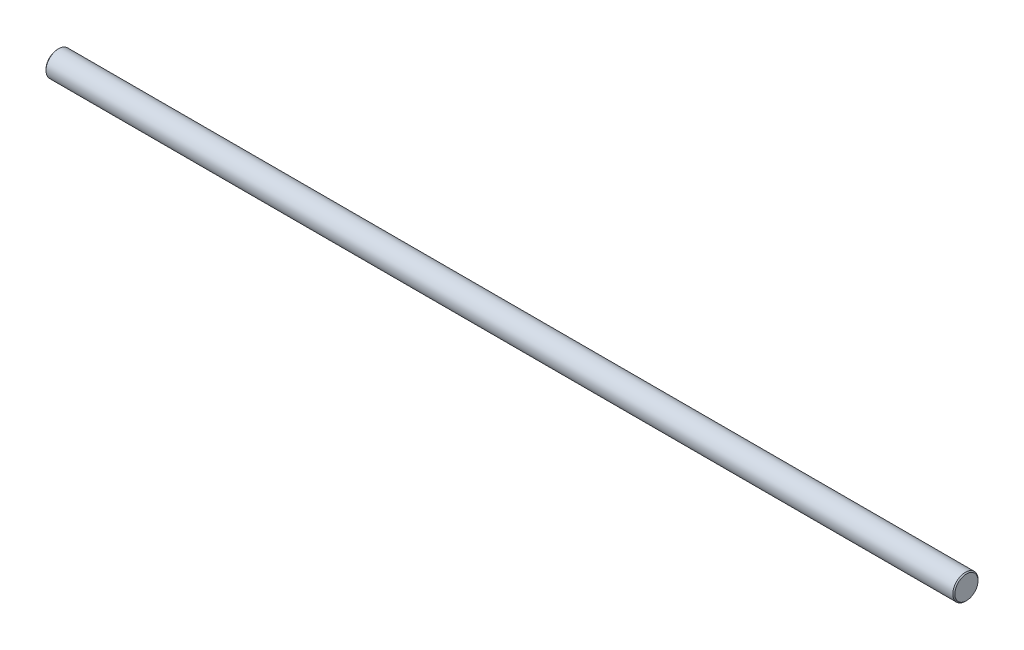
ISO-10303-21;
HEADER;
FILE_DESCRIPTION(('STEP AP214'),'2;1');
FILE_NAME('part.step','',(''),(''),'','','');
FILE_SCHEMA(('AUTOMOTIVE_DESIGN { 1 0 10303 214 1 1 1 1 }'));
ENDSEC;
DATA;
#1=APPLICATION_CONTEXT('core data for automotive mechanical design processes');
#2=APPLICATION_PROTOCOL_DEFINITION('international standard','automotive_design',2000,#1);
#3=PRODUCT_CONTEXT('',#1,'mechanical');
#4=PRODUCT('Part','Part','',(#3));
#5=PRODUCT_RELATED_PRODUCT_CATEGORY('part','',(#4));
#6=PRODUCT_DEFINITION_FORMATION('','',#4);
#7=PRODUCT_DEFINITION_CONTEXT('part definition',#1,'design');
#8=PRODUCT_DEFINITION('design','',#6,#7);
#9=PRODUCT_DEFINITION_SHAPE('','',#8);
#10=(LENGTH_UNIT() NAMED_UNIT(*) SI_UNIT(.MILLI.,.METRE.));
#11=(NAMED_UNIT(*) PLANE_ANGLE_UNIT() SI_UNIT($,.RADIAN.));
#12=(NAMED_UNIT(*) SI_UNIT($,.STERADIAN.) SOLID_ANGLE_UNIT());
#13=UNCERTAINTY_MEASURE_WITH_UNIT(LENGTH_MEASURE(1.E-05),#10,'distance_accuracy_value','');
#14=(GEOMETRIC_REPRESENTATION_CONTEXT(3) GLOBAL_UNCERTAINTY_ASSIGNED_CONTEXT((#13)) GLOBAL_UNIT_ASSIGNED_CONTEXT((#10,
#11,#12)) REPRESENTATION_CONTEXT('',''));
#15=CARTESIAN_POINT('',(0.,0.,0.));
#16=DIRECTION('',(0.,0.,1.));
#17=DIRECTION('',(1.,0.,0.));
#18=AXIS2_PLACEMENT_3D('',#15,#16,#17);
#19=CARTESIAN_POINT('',(228.6,0.,0.));
#20=DIRECTION('',(-1.,0.,0.));
#21=DIRECTION('',(0.,0.,1.));
#22=AXIS2_PLACEMENT_3D('',#19,#20,#21);
#23=CYLINDRICAL_SURFACE('',#22,6.34365);
#24=CARTESIAN_POINT('',(-228.092,0.,0.));
#25=DIRECTION('',(1.,0.,0.));
#26=DIRECTION('',(0.,0.,-1.));
#27=AXIS2_PLACEMENT_3D('',#24,#25,#26);
#28=CIRCLE('',#27,6.34365);
#29=CARTESIAN_POINT('',(-228.092,0.,-6.34365));
#30=VERTEX_POINT('',#29);
#31=EDGE_CURVE('E41',#30,#30,#28,.T.);
#32=ORIENTED_EDGE('',*,*,#31,.T.);
#33=EDGE_LOOP('',(#32));
#34=FACE_BOUND('',#33,.T.);
#35=CARTESIAN_POINT('',(228.092,0.,0.));
#36=DIRECTION('',(1.,0.,0.));
#37=DIRECTION('',(0.,0.,-1.));
#38=AXIS2_PLACEMENT_3D('',#35,#36,#37);
#39=CIRCLE('',#38,6.34365);
#40=CARTESIAN_POINT('',(228.092,0.,6.34365000000001));
#41=VERTEX_POINT('',#40);
#42=EDGE_CURVE('E45',#41,#41,#39,.F.);
#43=ORIENTED_EDGE('',*,*,#42,.T.);
#44=EDGE_LOOP('',(#43));
#45=FACE_BOUND('',#44,.T.);
#46=ADVANCED_FACE('F30',(#34,#45),#23,.T.);
#47=CARTESIAN_POINT('',(228.6,0.,0.));
#48=DIRECTION('',(1.,0.,0.));
#49=DIRECTION('',(0.,0.,-1.));
#50=AXIS2_PLACEMENT_3D('',#47,#48,#49);
#51=PLANE('',#50);
#52=CARTESIAN_POINT('',(228.6,0.,0.));
#53=DIRECTION('',(1.,0.,0.));
#54=DIRECTION('',(0.,0.,-1.));
#55=AXIS2_PLACEMENT_3D('',#52,#53,#54);
#56=CIRCLE('',#55,5.83564999999991);
#57=CARTESIAN_POINT('',(228.6,0.,5.83564999999993));
#58=VERTEX_POINT('',#57);
#59=EDGE_CURVE('E10',#58,#58,#56,.T.);
#60=ORIENTED_EDGE('',*,*,#59,.T.);
#61=EDGE_LOOP('',(#60));
#62=FACE_BOUND('',#61,.T.);
#63=ADVANCED_FACE('F61',(#62),#51,.T.);
#64=CARTESIAN_POINT('',(-228.6,0.,0.));
#65=DIRECTION('',(1.,0.,0.));
#66=DIRECTION('',(0.,0.,-1.));
#67=AXIS2_PLACEMENT_3D('',#64,#65,#66);
#68=PLANE('',#67);
#69=CARTESIAN_POINT('',(-228.6,0.,0.));
#70=DIRECTION('',(1.,0.,0.));
#71=DIRECTION('',(0.,0.,-1.));
#72=AXIS2_PLACEMENT_3D('',#69,#70,#71);
#73=CIRCLE('',#72,5.83565000000003);
#74=CARTESIAN_POINT('',(-228.6,0.,-5.83565000000003));
#75=VERTEX_POINT('',#74);
#76=EDGE_CURVE('E37',#75,#75,#73,.F.);
#77=ORIENTED_EDGE('',*,*,#76,.T.);
#78=EDGE_LOOP('',(#77));
#79=FACE_BOUND('',#78,.T.);
#80=ADVANCED_FACE('F58',(#79),#68,.F.);
#81=CARTESIAN_POINT('',(-228.092,0.,0.));
#82=DIRECTION('',(1.,0.,0.));
#83=DIRECTION('',(0.,0.,-1.));
#84=AXIS2_PLACEMENT_3D('',#81,#82,#83);
#85=CONICAL_SURFACE('',#84,6.34365,0.785398163397415);
#86=ORIENTED_EDGE('',*,*,#76,.F.);
#87=EDGE_LOOP('',(#86));
#88=FACE_BOUND('',#87,.T.);
#89=ORIENTED_EDGE('',*,*,#31,.F.);
#90=EDGE_LOOP('',(#89));
#91=FACE_BOUND('',#90,.T.);
#92=ADVANCED_FACE('F54',(#88,#91),#85,.T.);
#93=CARTESIAN_POINT('',(228.6,0.,0.));
#94=DIRECTION('',(-1.,0.,0.));
#95=DIRECTION('',(0.,0.,1.));
#96=AXIS2_PLACEMENT_3D('',#93,#94,#95);
#97=CONICAL_SURFACE('',#96,5.83564999999991,0.785398163397415);
#98=CARTESIAN_POINT('',(228.092,0.,6.34365000000001));
#99=CARTESIAN_POINT('',(228.097291666667,0.,6.33835833333335));
#100=CARTESIAN_POINT('',(228.102583333333,0.,6.33306666666668));
#101=CARTESIAN_POINT('',(228.113166666667,0.,6.32248333333334));
#102=CARTESIAN_POINT('',(228.118458333333,0.,6.31719166666668));
#103=CARTESIAN_POINT('',(228.129041666667,0.,6.30660833333334));
#104=CARTESIAN_POINT('',(228.134333333333,0.,6.30131666666667));
#105=CARTESIAN_POINT('',(228.144916666667,0.,6.29073333333334));
#106=CARTESIAN_POINT('',(228.150208333333,0.,6.28544166666667));
#107=CARTESIAN_POINT('',(228.160791666667,0.,6.27485833333334));
#108=CARTESIAN_POINT('',(228.166083333333,0.,6.26956666666667));
#109=CARTESIAN_POINT('',(228.176666666667,0.,6.25898333333333));
#110=CARTESIAN_POINT('',(228.181958333333,0.,6.25369166666667));
#111=CARTESIAN_POINT('',(228.192541666667,0.,6.24310833333333));
#112=CARTESIAN_POINT('',(228.197833333333,0.,6.23781666666666));
#113=CARTESIAN_POINT('',(228.208416666667,0.,6.22723333333333));
#114=CARTESIAN_POINT('',(228.213708333333,0.,6.22194166666666));
#115=CARTESIAN_POINT('',(228.224291666667,0.,6.21135833333333));
#116=CARTESIAN_POINT('',(228.229583333333,0.,6.20606666666666));
#117=CARTESIAN_POINT('',(228.240166666667,0.,6.19548333333332));
#118=CARTESIAN_POINT('',(228.245458333333,0.,6.19019166666665));
#119=CARTESIAN_POINT('',(228.256041666667,0.,6.17960833333332));
#120=CARTESIAN_POINT('',(228.261333333333,0.,6.17431666666665));
#121=CARTESIAN_POINT('',(228.271916666667,0.,6.16373333333332));
#122=CARTESIAN_POINT('',(228.277208333333,0.,6.15844166666665));
#123=CARTESIAN_POINT('',(228.287791666667,0.,6.14785833333331));
#124=CARTESIAN_POINT('',(228.293083333333,0.,6.14256666666665));
#125=CARTESIAN_POINT('',(228.303666666667,0.,6.13198333333331));
#126=CARTESIAN_POINT('',(228.308958333333,0.,6.12669166666664));
#127=CARTESIAN_POINT('',(228.319541666667,0.,6.11610833333331));
#128=CARTESIAN_POINT('',(228.324833333333,0.,6.11081666666664));
#129=CARTESIAN_POINT('',(228.335416666667,0.,6.1002333333333));
#130=CARTESIAN_POINT('',(228.340708333333,0.,6.09494166666664));
#131=CARTESIAN_POINT('',(228.351291666667,0.,6.08435833333331));
#132=CARTESIAN_POINT('',(228.356583333333,0.,6.07906666666664));
#133=CARTESIAN_POINT('',(228.367166666667,0.,6.0684833333333));
#134=CARTESIAN_POINT('',(228.372458333333,0.,6.06319166666663));
#135=CARTESIAN_POINT('',(228.383041666667,0.,6.0526083333333));
#136=CARTESIAN_POINT('',(228.388333333333,0.,6.04731666666663));
#137=CARTESIAN_POINT('',(228.398916666667,0.,6.0367333333333));
#138=CARTESIAN_POINT('',(228.404208333333,0.,6.03144166666663));
#139=CARTESIAN_POINT('',(228.414791666667,0.,6.02085833333329));
#140=CARTESIAN_POINT('',(228.420083333333,0.,6.01556666666662));
#141=CARTESIAN_POINT('',(228.430666666667,0.,6.00498333333329));
#142=CARTESIAN_POINT('',(228.435958333333,0.,5.99969166666662));
#143=CARTESIAN_POINT('',(228.446541666667,0.,5.98910833333329));
#144=CARTESIAN_POINT('',(228.451833333333,0.,5.98381666666662));
#145=CARTESIAN_POINT('',(228.462416666667,0.,5.97323333333328));
#146=CARTESIAN_POINT('',(228.467708333333,0.,5.96794166666662));
#147=CARTESIAN_POINT('',(228.478291666667,0.,5.95735833333328));
#148=CARTESIAN_POINT('',(228.483583333333,0.,5.95206666666661));
#149=CARTESIAN_POINT('',(228.494166666667,0.,5.94148333333328));
#150=CARTESIAN_POINT('',(228.499458333333,0.,5.93619166666661));
#151=CARTESIAN_POINT('',(228.510041666667,0.,5.92560833333328));
#152=CARTESIAN_POINT('',(228.515333333333,0.,5.92031666666661));
#153=CARTESIAN_POINT('',(228.525916666667,0.,5.90973333333328));
#154=CARTESIAN_POINT('',(228.531208333333,0.,5.90444166666661));
#155=CARTESIAN_POINT('',(228.541791666667,0.,5.89385833333327));
#156=CARTESIAN_POINT('',(228.547083333333,0.,5.8885666666666));
#157=CARTESIAN_POINT('',(228.557666666667,0.,5.87798333333327));
#158=CARTESIAN_POINT('',(228.562958333333,0.,5.8726916666666));
#159=CARTESIAN_POINT('',(228.573541666667,0.,5.86210833333327));
#160=CARTESIAN_POINT('',(228.578833333333,0.,5.8568166666666));
#161=CARTESIAN_POINT('',(228.589416666667,0.,5.84623333333326));
#162=CARTESIAN_POINT('',(228.594708333333,0.,5.84094166666659));
#163=CARTESIAN_POINT('',(228.6,0.,5.83564999999993));
#164=B_SPLINE_CURVE_WITH_KNOTS('',3,(#98,#99,#100,#101,#102,#103,#104,#105,#106,#107,#108,#109,
#110,#111,#112,#113,#114,#115,#116,#117,#118,#119,#120,#121,#122,#123,#124,#125,#126,#127,#128,
#129,#130,#131,#132,#133,#134,#135,#136,#137,#138,#139,#140,#141,#142,#143,#144,#145,#146,#147,
#148,#149,#150,#151,#152,#153,#154,#155,#156,#157,#158,#159,#160,#161,#162,#163),.UNSPECIFIED.,
.F.,.F.,(4,2,2,2,2,2,2,2,2,2,2,2,2,2,2,2,2,2,2,2,2,2,2,2,2,2,2,2,2,2,2,2,4),(0.,
0.0224506403026739,0.0449012806053477,0.067351920908021,0.0898025612106949,0.112253201513369,
0.134703841816062,0.157154482118735,0.179605122421409,0.202055762724083,0.224506403026757,
0.246957043329451,0.269407683632124,0.291858323934798,0.314308964237472,0.336759604540145,
0.359210244842839,0.381660885145512,0.404111525448186,0.42656216575086,0.449012806053534,
0.471463446356207,0.493914086658901,0.516364726961575,0.538815367264248,0.561266007566922,
0.583716647869596,0.606167288172289,0.628617928474963,0.651068568777637,0.67351920908031,
0.695969849382984,0.718420489685677),.UNSPECIFIED.);
#165=EDGE_CURVE('BSEAM32',#41,#58,#164,.T.);
#166=ORIENTED_EDGE('',*,*,#42,.F.);
#167=ORIENTED_EDGE('',*,*,#59,.F.);
#168=ORIENTED_EDGE('',*,*,#165,.T.);
#169=ORIENTED_EDGE('',*,*,#165,.F.);
#170=EDGE_LOOP('',(#166,#168,#167,#169));
#171=FACE_BOUND('',#170,.T.);
#172=ADVANCED_FACE('F32',(#171),#97,.T.);
#173=CLOSED_SHELL('',(#46,#63,#80,#92,#172));
#174=MANIFOLD_SOLID_BREP('B2',#173);
#175=ADVANCED_BREP_SHAPE_REPRESENTATION('',(#18,#174),#14);
#176=SHAPE_DEFINITION_REPRESENTATION(#9,#175);
ENDSEC;
END-ISO-10303-21;
